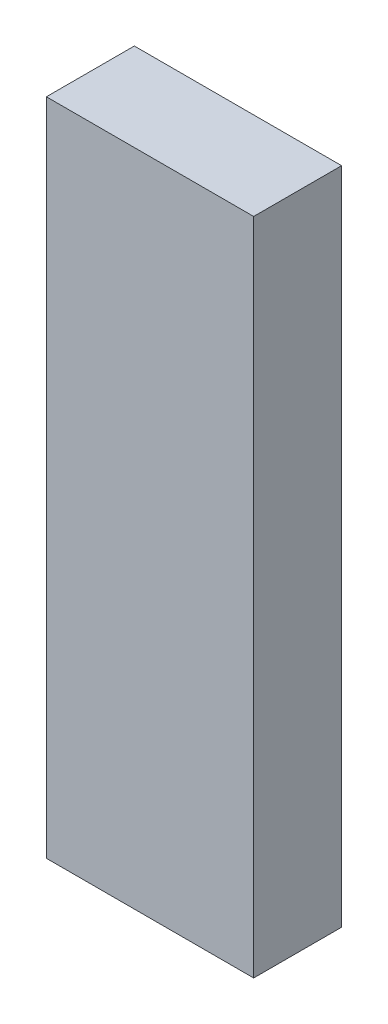
ISO-10303-21;
HEADER;
FILE_DESCRIPTION(('STEP AP214'),'2;1');
FILE_NAME('part.step','',(''),(''),'','','');
FILE_SCHEMA(('AUTOMOTIVE_DESIGN { 1 0 10303 214 1 1 1 1 }'));
ENDSEC;
DATA;
#1=APPLICATION_CONTEXT('core data for automotive mechanical design processes');
#2=APPLICATION_PROTOCOL_DEFINITION('international standard','automotive_design',2000,#1);
#3=PRODUCT_CONTEXT('',#1,'mechanical');
#4=PRODUCT('Part','Part','',(#3));
#5=PRODUCT_RELATED_PRODUCT_CATEGORY('part','',(#4));
#6=PRODUCT_DEFINITION_FORMATION('','',#4);
#7=PRODUCT_DEFINITION_CONTEXT('part definition',#1,'design');
#8=PRODUCT_DEFINITION('design','',#6,#7);
#9=PRODUCT_DEFINITION_SHAPE('','',#8);
#10=(LENGTH_UNIT() NAMED_UNIT(*) SI_UNIT(.MILLI.,.METRE.));
#11=(NAMED_UNIT(*) PLANE_ANGLE_UNIT() SI_UNIT($,.RADIAN.));
#12=(NAMED_UNIT(*) SI_UNIT($,.STERADIAN.) SOLID_ANGLE_UNIT());
#13=UNCERTAINTY_MEASURE_WITH_UNIT(LENGTH_MEASURE(1.E-05),#10,'distance_accuracy_value','');
#14=(GEOMETRIC_REPRESENTATION_CONTEXT(3) GLOBAL_UNCERTAINTY_ASSIGNED_CONTEXT((#13)) GLOBAL_UNIT_ASSIGNED_CONTEXT((#10,
#11,#12)) REPRESENTATION_CONTEXT('',''));
#15=CARTESIAN_POINT('',(0.,0.,0.));
#16=DIRECTION('',(0.,0.,1.));
#17=DIRECTION('',(1.,0.,0.));
#18=AXIS2_PLACEMENT_3D('',#15,#16,#17);
#19=CARTESIAN_POINT('',(0.,0.,14.));
#20=DIRECTION('',(1.,0.,0.));
#21=DIRECTION('',(0.,0.,-1.));
#22=AXIS2_PLACEMENT_3D('',#19,#20,#21);
#23=PLANE('',#22);
#24=DIRECTION('',(0.,-1.,0.));
#25=VECTOR('',#24,1.);
#26=CARTESIAN_POINT('',(0.,0.,0.));
#27=LINE('',#26,#25);
#28=CARTESIAN_POINT('',(0.,105.,0.));
#29=VERTEX_POINT('',#28);
#30=CARTESIAN_POINT('',(0.,0.,0.));
#31=VERTEX_POINT('',#30);
#32=EDGE_CURVE('E96',#29,#31,#27,.T.);
#33=ORIENTED_EDGE('',*,*,#32,.T.);
#34=DIRECTION('',(0.,0.,-1.));
#35=VECTOR('',#34,1.);
#36=CARTESIAN_POINT('',(0.,0.,14.));
#37=LINE('',#36,#35);
#38=CARTESIAN_POINT('',(0.,0.,14.));
#39=VERTEX_POINT('',#38);
#40=EDGE_CURVE('E11',#39,#31,#37,.T.);
#41=ORIENTED_EDGE('',*,*,#40,.F.);
#42=DIRECTION('',(0.,-1.,0.));
#43=VECTOR('',#42,1.);
#44=CARTESIAN_POINT('',(0.,0.,14.));
#45=LINE('',#44,#43);
#46=CARTESIAN_POINT('',(0.,105.,14.));
#47=VERTEX_POINT('',#46);
#48=EDGE_CURVE('E84',#47,#39,#45,.T.);
#49=ORIENTED_EDGE('',*,*,#48,.F.);
#50=DIRECTION('',(0.,0.,-1.));
#51=VECTOR('',#50,1.);
#52=CARTESIAN_POINT('',(0.,105.,14.));
#53=LINE('',#52,#51);
#54=EDGE_CURVE('E92',#47,#29,#53,.T.);
#55=ORIENTED_EDGE('',*,*,#54,.T.);
#56=EDGE_LOOP('',(#33,#41,#49,#55));
#57=FACE_BOUND('',#56,.T.);
#58=ADVANCED_FACE('F33',(#57),#23,.F.);
#59=CARTESIAN_POINT('',(0.,0.,14.));
#60=DIRECTION('',(0.,1.,0.));
#61=DIRECTION('',(0.,0.,1.));
#62=AXIS2_PLACEMENT_3D('',#59,#60,#61);
#63=PLANE('',#62);
#64=DIRECTION('',(1.,0.,0.));
#65=VECTOR('',#64,1.);
#66=CARTESIAN_POINT('',(0.,0.,0.));
#67=LINE('',#66,#65);
#68=CARTESIAN_POINT('',(33.,0.,0.));
#69=VERTEX_POINT('',#68);
#70=EDGE_CURVE('E88',#31,#69,#67,.T.);
#71=ORIENTED_EDGE('',*,*,#70,.T.);
#72=DIRECTION('',(0.,0.,-1.));
#73=VECTOR('',#72,1.);
#74=CARTESIAN_POINT('',(33.,0.,14.));
#75=LINE('',#74,#73);
#76=CARTESIAN_POINT('',(33.,0.,14.));
#77=VERTEX_POINT('',#76);
#78=EDGE_CURVE('E41',#77,#69,#75,.T.);
#79=ORIENTED_EDGE('',*,*,#78,.F.);
#80=DIRECTION('',(1.,0.,0.));
#81=VECTOR('',#80,1.);
#82=CARTESIAN_POINT('',(0.,0.,14.));
#83=LINE('',#82,#81);
#84=EDGE_CURVE('E79',#39,#77,#83,.T.);
#85=ORIENTED_EDGE('',*,*,#84,.F.);
#86=ORIENTED_EDGE('',*,*,#40,.T.);
#87=EDGE_LOOP('',(#71,#79,#85,#86));
#88=FACE_BOUND('',#87,.T.);
#89=ADVANCED_FACE('F87',(#88),#63,.F.);
#90=CARTESIAN_POINT('',(33.,0.,14.));
#91=DIRECTION('',(-1.,0.,0.));
#92=DIRECTION('',(0.,0.,1.));
#93=AXIS2_PLACEMENT_3D('',#90,#91,#92);
#94=PLANE('',#93);
#95=DIRECTION('',(0.,1.,0.));
#96=VECTOR('',#95,1.);
#97=CARTESIAN_POINT('',(33.,0.,0.));
#98=LINE('',#97,#96);
#99=CARTESIAN_POINT('',(33.,105.,0.));
#100=VERTEX_POINT('',#99);
#101=EDGE_CURVE('E66',#69,#100,#98,.T.);
#102=ORIENTED_EDGE('',*,*,#101,.T.);
#103=DIRECTION('',(0.,0.,-1.));
#104=VECTOR('',#103,1.);
#105=CARTESIAN_POINT('',(33.,105.,14.));
#106=LINE('',#105,#104);
#107=CARTESIAN_POINT('',(33.,105.,14.));
#108=VERTEX_POINT('',#107);
#109=EDGE_CURVE('E89',#108,#100,#106,.T.);
#110=ORIENTED_EDGE('',*,*,#109,.F.);
#111=DIRECTION('',(0.,1.,0.));
#112=VECTOR('',#111,1.);
#113=CARTESIAN_POINT('',(33.,0.,14.));
#114=LINE('',#113,#112);
#115=EDGE_CURVE('E82',#77,#108,#114,.T.);
#116=ORIENTED_EDGE('',*,*,#115,.F.);
#117=ORIENTED_EDGE('',*,*,#78,.T.);
#118=EDGE_LOOP('',(#102,#110,#116,#117));
#119=FACE_BOUND('',#118,.T.);
#120=ADVANCED_FACE('F90',(#119),#94,.F.);
#121=CARTESIAN_POINT('',(0.,105.,14.));
#122=DIRECTION('',(0.,-1.,0.));
#123=DIRECTION('',(0.,0.,-1.));
#124=AXIS2_PLACEMENT_3D('',#121,#122,#123);
#125=PLANE('',#124);
#126=DIRECTION('',(-1.,0.,0.));
#127=VECTOR('',#126,1.);
#128=CARTESIAN_POINT('',(0.,105.,0.));
#129=LINE('',#128,#127);
#130=EDGE_CURVE('E72',#100,#29,#129,.T.);
#131=ORIENTED_EDGE('',*,*,#130,.T.);
#132=ORIENTED_EDGE('',*,*,#54,.F.);
#133=DIRECTION('',(-1.,0.,0.));
#134=VECTOR('',#133,1.);
#135=CARTESIAN_POINT('',(0.,105.,14.));
#136=LINE('',#135,#134);
#137=EDGE_CURVE('E49',#108,#47,#136,.T.);
#138=ORIENTED_EDGE('',*,*,#137,.F.);
#139=ORIENTED_EDGE('',*,*,#109,.T.);
#140=EDGE_LOOP('',(#131,#132,#138,#139));
#141=FACE_BOUND('',#140,.T.);
#142=ADVANCED_FACE('F103',(#141),#125,.F.);
#143=CARTESIAN_POINT('',(0.,0.,14.));
#144=DIRECTION('',(0.,0.,-1.));
#145=DIRECTION('',(-1.,0.,0.));
#146=AXIS2_PLACEMENT_3D('',#143,#144,#145);
#147=PLANE('',#146);
#148=ORIENTED_EDGE('',*,*,#48,.T.);
#149=ORIENTED_EDGE('',*,*,#84,.T.);
#150=ORIENTED_EDGE('',*,*,#115,.T.);
#151=ORIENTED_EDGE('',*,*,#137,.T.);
#152=EDGE_LOOP('',(#148,#149,#150,#151));
#153=FACE_BOUND('',#152,.T.);
#154=ADVANCED_FACE('F80',(#153),#147,.F.);
#155=CARTESIAN_POINT('',(0.,0.,0.));
#156=DIRECTION('',(0.,0.,-1.));
#157=DIRECTION('',(-1.,0.,0.));
#158=AXIS2_PLACEMENT_3D('',#155,#156,#157);
#159=PLANE('',#158);
#160=ORIENTED_EDGE('',*,*,#32,.F.);
#161=ORIENTED_EDGE('',*,*,#130,.F.);
#162=ORIENTED_EDGE('',*,*,#101,.F.);
#163=ORIENTED_EDGE('',*,*,#70,.F.);
#164=EDGE_LOOP('',(#160,#161,#162,#163));
#165=FACE_BOUND('',#164,.T.);
#166=ADVANCED_FACE('F106',(#165),#159,.T.);
#167=CLOSED_SHELL('',(#58,#89,#120,#142,#154,#166));
#168=MANIFOLD_SOLID_BREP('B2',#167);
#169=ADVANCED_BREP_SHAPE_REPRESENTATION('',(#18,#168),#14);
#170=SHAPE_DEFINITION_REPRESENTATION(#9,#169);
ENDSEC;
END-ISO-10303-21;
